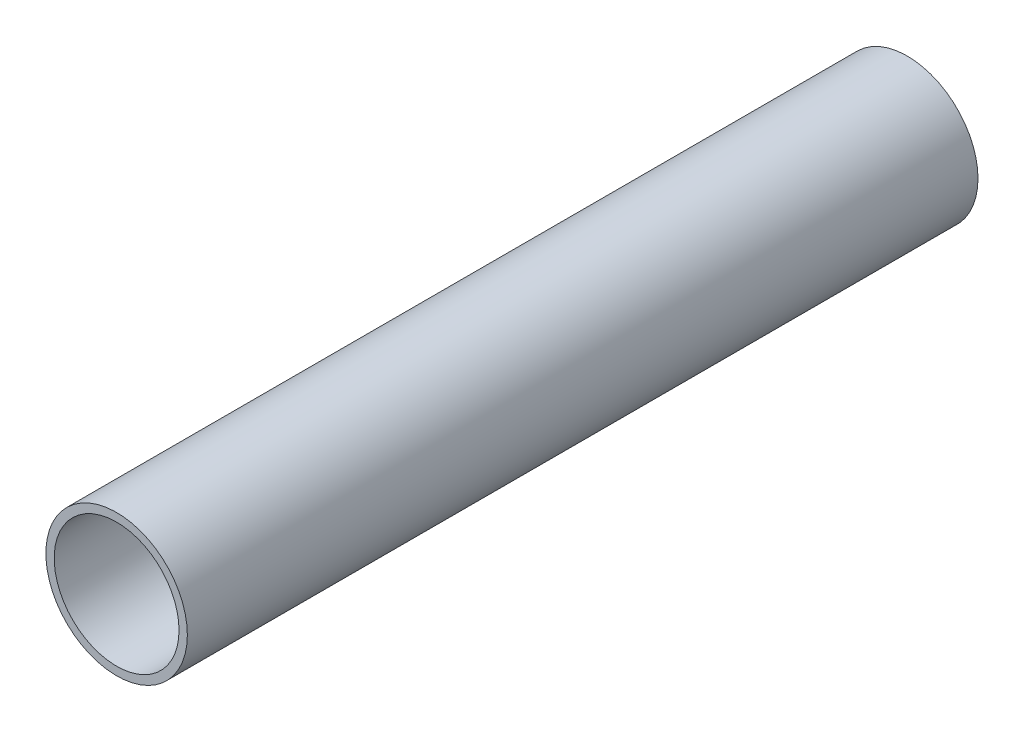
ISO-10303-21;
HEADER;
FILE_DESCRIPTION(('STEP AP214'),'2;1');
FILE_NAME('part.step','',(''),(''),'','','');
FILE_SCHEMA(('AUTOMOTIVE_DESIGN { 1 0 10303 214 1 1 1 1 }'));
ENDSEC;
DATA;
#1=APPLICATION_CONTEXT('core data for automotive mechanical design processes');
#2=APPLICATION_PROTOCOL_DEFINITION('international standard','automotive_design',2000,#1);
#3=PRODUCT_CONTEXT('',#1,'mechanical');
#4=PRODUCT('Part','Part','',(#3));
#5=PRODUCT_RELATED_PRODUCT_CATEGORY('part','',(#4));
#6=PRODUCT_DEFINITION_FORMATION('','',#4);
#7=PRODUCT_DEFINITION_CONTEXT('part definition',#1,'design');
#8=PRODUCT_DEFINITION('design','',#6,#7);
#9=PRODUCT_DEFINITION_SHAPE('','',#8);
#10=(LENGTH_UNIT() NAMED_UNIT(*) SI_UNIT(.MILLI.,.METRE.));
#11=(NAMED_UNIT(*) PLANE_ANGLE_UNIT() SI_UNIT($,.RADIAN.));
#12=(NAMED_UNIT(*) SI_UNIT($,.STERADIAN.) SOLID_ANGLE_UNIT());
#13=UNCERTAINTY_MEASURE_WITH_UNIT(LENGTH_MEASURE(1.E-05),#10,'distance_accuracy_value','');
#14=(GEOMETRIC_REPRESENTATION_CONTEXT(3) GLOBAL_UNCERTAINTY_ASSIGNED_CONTEXT((#13)) GLOBAL_UNIT_ASSIGNED_CONTEXT((#10,
#11,#12)) REPRESENTATION_CONTEXT('',''));
#15=CARTESIAN_POINT('',(0.,0.,0.));
#16=DIRECTION('',(0.,0.,1.));
#17=DIRECTION('',(1.,0.,0.));
#18=AXIS2_PLACEMENT_3D('',#15,#16,#17);
#19=CARTESIAN_POINT('',(0.,0.,95.));
#20=DIRECTION('',(0.,0.,-1.));
#21=DIRECTION('',(-1.,0.,0.));
#22=AXIS2_PLACEMENT_3D('',#19,#20,#21);
#23=CYLINDRICAL_SURFACE('',#22,15.);
#24=CARTESIAN_POINT('',(0.,0.,95.));
#25=DIRECTION('',(0.,0.,1.));
#26=DIRECTION('',(1.,0.,0.));
#27=AXIS2_PLACEMENT_3D('',#24,#25,#26);
#28=CIRCLE('',#27,15.);
#29=CARTESIAN_POINT('',(15.,0.,95.));
#30=VERTEX_POINT('',#29);
#31=EDGE_CURVE('E40',#30,#30,#28,.T.);
#32=ORIENTED_EDGE('',*,*,#31,.T.);
#33=EDGE_LOOP('',(#32));
#34=FACE_BOUND('',#33,.T.);
#35=CARTESIAN_POINT('',(0.,0.,-95.));
#36=DIRECTION('',(0.,0.,1.));
#37=DIRECTION('',(1.,0.,0.));
#38=AXIS2_PLACEMENT_3D('',#35,#36,#37);
#39=CIRCLE('',#38,15.);
#40=CARTESIAN_POINT('',(15.,0.,-95.));
#41=VERTEX_POINT('',#40);
#42=EDGE_CURVE('E46',#41,#41,#39,.T.);
#43=ORIENTED_EDGE('',*,*,#42,.F.);
#44=EDGE_LOOP('',(#43));
#45=FACE_BOUND('',#44,.T.);
#46=ADVANCED_FACE('F33',(#34,#45),#23,.F.);
#47=CARTESIAN_POINT('',(0.,0.,95.));
#48=DIRECTION('',(0.,0.,-1.));
#49=DIRECTION('',(-1.,0.,0.));
#50=AXIS2_PLACEMENT_3D('',#47,#48,#49);
#51=CYLINDRICAL_SURFACE('',#50,17.);
#52=CARTESIAN_POINT('',(0.,0.,95.));
#53=DIRECTION('',(0.,0.,1.));
#54=DIRECTION('',(1.,0.,0.));
#55=AXIS2_PLACEMENT_3D('',#52,#53,#54);
#56=CIRCLE('',#55,17.);
#57=CARTESIAN_POINT('',(17.,0.,95.));
#58=VERTEX_POINT('',#57);
#59=EDGE_CURVE('E10',#58,#58,#56,.T.);
#60=ORIENTED_EDGE('',*,*,#59,.F.);
#61=EDGE_LOOP('',(#60));
#62=FACE_BOUND('',#61,.T.);
#63=CARTESIAN_POINT('',(0.,0.,-95.));
#64=DIRECTION('',(0.,0.,1.));
#65=DIRECTION('',(1.,0.,0.));
#66=AXIS2_PLACEMENT_3D('',#63,#64,#65);
#67=CIRCLE('',#66,17.);
#68=CARTESIAN_POINT('',(17.,0.,-95.));
#69=VERTEX_POINT('',#68);
#70=EDGE_CURVE('E36',#69,#69,#67,.T.);
#71=ORIENTED_EDGE('',*,*,#70,.T.);
#72=EDGE_LOOP('',(#71));
#73=FACE_BOUND('',#72,.T.);
#74=ADVANCED_FACE('F53',(#62,#73),#51,.T.);
#75=CARTESIAN_POINT('',(0.,0.,95.));
#76=DIRECTION('',(0.,0.,1.));
#77=DIRECTION('',(1.,0.,0.));
#78=AXIS2_PLACEMENT_3D('',#75,#76,#77);
#79=PLANE('',#78);
#80=ORIENTED_EDGE('',*,*,#31,.F.);
#81=EDGE_LOOP('',(#80));
#82=FACE_BOUND('',#81,.T.);
#83=ORIENTED_EDGE('',*,*,#59,.T.);
#84=EDGE_LOOP('',(#83));
#85=FACE_BOUND('',#84,.T.);
#86=ADVANCED_FACE('F57',(#82,#85),#79,.T.);
#87=CARTESIAN_POINT('',(0.,0.,-95.));
#88=DIRECTION('',(0.,0.,1.));
#89=DIRECTION('',(1.,0.,0.));
#90=AXIS2_PLACEMENT_3D('',#87,#88,#89);
#91=PLANE('',#90);
#92=ORIENTED_EDGE('',*,*,#42,.T.);
#93=EDGE_LOOP('',(#92));
#94=FACE_BOUND('',#93,.T.);
#95=ORIENTED_EDGE('',*,*,#70,.F.);
#96=EDGE_LOOP('',(#95));
#97=FACE_BOUND('',#96,.T.);
#98=ADVANCED_FACE('F55',(#94,#97),#91,.F.);
#99=CLOSED_SHELL('',(#46,#74,#86,#98));
#100=MANIFOLD_SOLID_BREP('B2',#99);
#101=ADVANCED_BREP_SHAPE_REPRESENTATION('',(#18,#100),#14);
#102=SHAPE_DEFINITION_REPRESENTATION(#9,#101);
ENDSEC;
END-ISO-10303-21;
